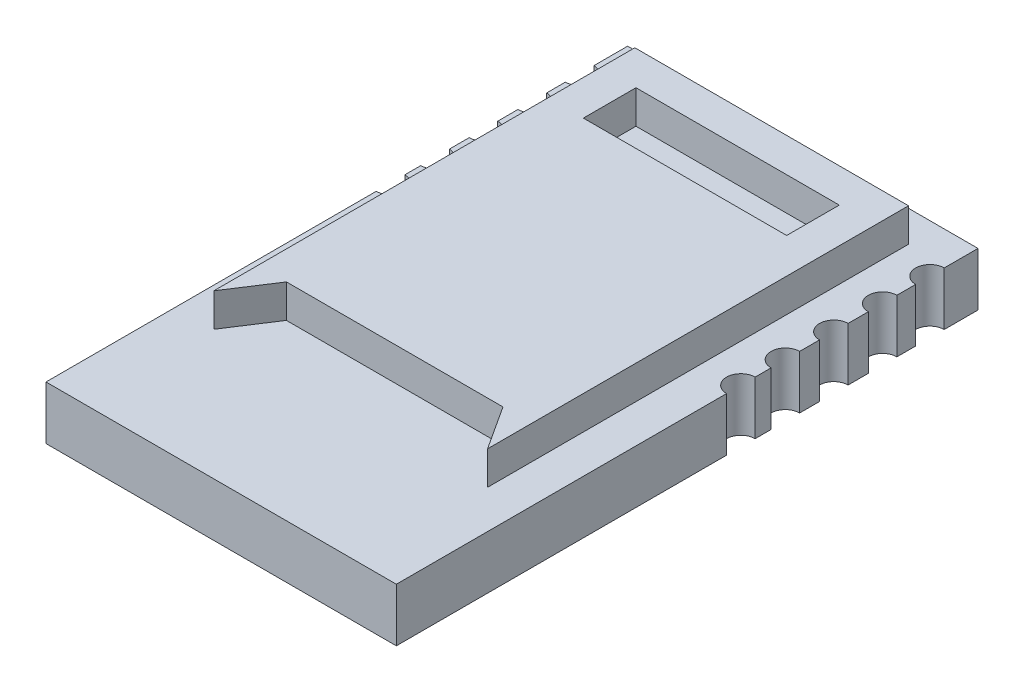
ISO-10303-21;
HEADER;
FILE_DESCRIPTION(('STEP AP214'),'2;1');
FILE_NAME('part.step','',(''),(''),'','','');
FILE_SCHEMA(('AUTOMOTIVE_DESIGN { 1 0 10303 214 1 1 1 1 }'));
ENDSEC;
DATA;
#1=APPLICATION_CONTEXT('core data for automotive mechanical design processes');
#2=APPLICATION_PROTOCOL_DEFINITION('international standard','automotive_design',2000,#1);
#3=PRODUCT_CONTEXT('',#1,'mechanical');
#4=PRODUCT('Part','Part','',(#3));
#5=PRODUCT_RELATED_PRODUCT_CATEGORY('part','',(#4));
#6=PRODUCT_DEFINITION_FORMATION('','',#4);
#7=PRODUCT_DEFINITION_CONTEXT('part definition',#1,'design');
#8=PRODUCT_DEFINITION('design','',#6,#7);
#9=PRODUCT_DEFINITION_SHAPE('','',#8);
#10=(LENGTH_UNIT() NAMED_UNIT(*) SI_UNIT(.MILLI.,.METRE.));
#11=(NAMED_UNIT(*) PLANE_ANGLE_UNIT() SI_UNIT($,.RADIAN.));
#12=(NAMED_UNIT(*) SI_UNIT($,.STERADIAN.) SOLID_ANGLE_UNIT());
#13=UNCERTAINTY_MEASURE_WITH_UNIT(LENGTH_MEASURE(1.E-05),#10,'distance_accuracy_value','');
#14=(GEOMETRIC_REPRESENTATION_CONTEXT(3) GLOBAL_UNCERTAINTY_ASSIGNED_CONTEXT((#13)) GLOBAL_UNIT_ASSIGNED_CONTEXT((#10,
#11,#12)) REPRESENTATION_CONTEXT('',''));
#15=CARTESIAN_POINT('',(0.,0.,0.));
#16=DIRECTION('',(0.,0.,1.));
#17=DIRECTION('',(1.,0.,0.));
#18=AXIS2_PLACEMENT_3D('',#15,#16,#17);
#19=CARTESIAN_POINT('',(0.,8.,0.));
#20=DIRECTION('',(0.,1.,0.));
#21=DIRECTION('',(0.,0.,1.));
#22=AXIS2_PLACEMENT_3D('',#19,#20,#21);
#23=PLANE('',#22);
#24=CARTESIAN_POINT('',(-46.7701166967711,8.,-6.06432348706643));
#25=DIRECTION('',(0.,1.,0.));
#26=DIRECTION('',(0.,0.,1.));
#27=AXIS2_PLACEMENT_3D('',#24,#25,#26);
#28=CIRCLE('',#27,2.14096958321621);
#29=CARTESIAN_POINT('',(-46.7701166967711,8.,-3.92335390385021));
#30=VERTEX_POINT('',#29);
#31=CARTESIAN_POINT('',(-46.7701166967711,8.,-8.20529307028264));
#32=VERTEX_POINT('',#31);
#33=EDGE_CURVE('E345',#30,#32,#28,.T.);
#34=ORIENTED_EDGE('',*,*,#33,.F.);
#35=DIRECTION('',(0.,0.,1.));
#36=VECTOR('',#35,1.);
#37=CARTESIAN_POINT('',(-46.7701166967711,8.,0.));
#38=LINE('',#37,#36);
#39=CARTESIAN_POINT('',(-46.7701166967711,8.,45.5749519462527));
#40=VERTEX_POINT('',#39);
#41=EDGE_CURVE('E348',#30,#40,#38,.T.);
#42=ORIENTED_EDGE('',*,*,#41,.T.);
#43=DIRECTION('',(1.,0.,0.));
#44=VECTOR('',#43,1.);
#45=CARTESIAN_POINT('',(0.,8.,45.5749519462527));
#46=LINE('',#45,#44);
#47=CARTESIAN_POINT('',(5.74475937987076,8.,45.5749519462527));
#48=VERTEX_POINT('',#47);
#49=EDGE_CURVE('E351',#40,#48,#46,.T.);
#50=ORIENTED_EDGE('',*,*,#49,.T.);
#51=DIRECTION('',(0.,0.,1.));
#52=VECTOR('',#51,1.);
#53=CARTESIAN_POINT('',(5.74475937987076,8.,0.));
#54=LINE('',#53,#52);
#55=CARTESIAN_POINT('',(5.74475937987076,8.,-3.92335390385021));
#56=VERTEX_POINT('',#55);
#57=EDGE_CURVE('E355',#56,#48,#54,.T.);
#58=ORIENTED_EDGE('',*,*,#57,.F.);
#59=CARTESIAN_POINT('',(5.74475937987076,8.,-6.06432348706643));
#60=DIRECTION('',(0.,1.,0.));
#61=DIRECTION('',(0.,0.,1.));
#62=AXIS2_PLACEMENT_3D('',#59,#60,#61);
#63=CIRCLE('',#62,2.14096958321622);
#64=CARTESIAN_POINT('',(5.74475937987076,8.,-8.20529307028264));
#65=VERTEX_POINT('',#64);
#66=EDGE_CURVE('E358',#56,#65,#63,.F.);
#67=ORIENTED_EDGE('',*,*,#66,.T.);
#68=CARTESIAN_POINT('',(5.74475937987076,8.,-10.5953432018892));
#69=VERTEX_POINT('',#68);
#70=EDGE_CURVE('E360',#69,#65,#54,.T.);
#71=ORIENTED_EDGE('',*,*,#70,.F.);
#72=CARTESIAN_POINT('',(5.74475937987076,8.,-12.7363127851054));
#73=DIRECTION('',(0.,1.,0.));
#74=DIRECTION('',(0.,0.,1.));
#75=AXIS2_PLACEMENT_3D('',#72,#73,#74);
#76=CIRCLE('',#75,2.14096958321622);
#77=CARTESIAN_POINT('',(5.74475937987076,8.,-14.8772823683217));
#78=VERTEX_POINT('',#77);
#79=EDGE_CURVE('E362',#69,#78,#76,.F.);
#80=ORIENTED_EDGE('',*,*,#79,.T.);
#81=CARTESIAN_POINT('',(5.74475937987076,8.,-17.8568692999403));
#82=VERTEX_POINT('',#81);
#83=EDGE_CURVE('E364',#82,#78,#54,.T.);
#84=ORIENTED_EDGE('',*,*,#83,.F.);
#85=CARTESIAN_POINT('',(5.74475937987076,8.,-19.9978388831565));
#86=DIRECTION('',(0.,1.,0.));
#87=DIRECTION('',(0.,0.,1.));
#88=AXIS2_PLACEMENT_3D('',#85,#86,#87);
#89=CIRCLE('',#88,2.14096958321622);
#90=CARTESIAN_POINT('',(5.74475937987076,8.,-22.1388084663727));
#91=VERTEX_POINT('',#90);
#92=EDGE_CURVE('E365',#82,#91,#89,.F.);
#93=ORIENTED_EDGE('',*,*,#92,.T.);
#94=CARTESIAN_POINT('',(5.74475937987076,8.,-25.1734069593402));
#95=VERTEX_POINT('',#94);
#96=EDGE_CURVE('E367',#95,#91,#54,.T.);
#97=ORIENTED_EDGE('',*,*,#96,.F.);
#98=CARTESIAN_POINT('',(5.74475937987076,8.,-27.3143765425564));
#99=DIRECTION('',(0.,1.,0.));
#100=DIRECTION('',(0.,0.,1.));
#101=AXIS2_PLACEMENT_3D('',#98,#99,#100);
#102=CIRCLE('',#101,2.14096958321622);
#103=CARTESIAN_POINT('',(5.74475937987076,8.,-29.4553461257726));
#104=VERTEX_POINT('',#103);
#105=EDGE_CURVE('E368',#95,#104,#102,.F.);
#106=ORIENTED_EDGE('',*,*,#105,.T.);
#107=CARTESIAN_POINT('',(5.74475937987076,8.,-32.2654170639548));
#108=VERTEX_POINT('',#107);
#109=EDGE_CURVE('E370',#108,#104,#54,.T.);
#110=ORIENTED_EDGE('',*,*,#109,.F.);
#111=CARTESIAN_POINT('',(5.74475937987076,8.,-34.406386647171));
#112=DIRECTION('',(0.,1.,0.));
#113=DIRECTION('',(0.,0.,1.));
#114=AXIS2_PLACEMENT_3D('',#111,#112,#113);
#115=CIRCLE('',#114,2.14096958321622);
#116=CARTESIAN_POINT('',(5.74475937987076,8.,-36.5473562303872));
#117=VERTEX_POINT('',#116);
#118=EDGE_CURVE('E371',#108,#117,#115,.F.);
#119=ORIENTED_EDGE('',*,*,#118,.T.);
#120=CARTESIAN_POINT('',(5.74475937987075,8.,-41.6119126465786));
#121=VERTEX_POINT('',#120);
#122=EDGE_CURVE('E359',#121,#117,#54,.T.);
#123=ORIENTED_EDGE('',*,*,#122,.F.);
#124=DIRECTION('',(1.,0.,0.));
#125=VECTOR('',#124,1.);
#126=CARTESIAN_POINT('',(0.,8.,-41.6119126465786));
#127=LINE('',#126,#125);
#128=CARTESIAN_POINT('',(-46.7701166967711,8.,-41.6119126465786));
#129=VERTEX_POINT('',#128);
#130=EDGE_CURVE('E373',#129,#121,#127,.T.);
#131=ORIENTED_EDGE('',*,*,#130,.F.);
#132=CARTESIAN_POINT('',(-46.7701166967711,8.,-36.5473562303872));
#133=VERTEX_POINT('',#132);
#134=EDGE_CURVE('E353',#129,#133,#38,.T.);
#135=ORIENTED_EDGE('',*,*,#134,.T.);
#136=CARTESIAN_POINT('',(-46.7701166967711,8.,-34.406386647171));
#137=DIRECTION('',(0.,1.,0.));
#138=DIRECTION('',(0.,0.,1.));
#139=AXIS2_PLACEMENT_3D('',#136,#137,#138);
#140=CIRCLE('',#139,2.14096958321621);
#141=CARTESIAN_POINT('',(-46.7701166967711,8.,-32.2654170639548));
#142=VERTEX_POINT('',#141);
#143=EDGE_CURVE('E376',#142,#133,#140,.T.);
#144=ORIENTED_EDGE('',*,*,#143,.F.);
#145=CARTESIAN_POINT('',(-46.7701166967711,8.,-29.4553461257726));
#146=VERTEX_POINT('',#145);
#147=EDGE_CURVE('E379',#142,#146,#38,.T.);
#148=ORIENTED_EDGE('',*,*,#147,.T.);
#149=CARTESIAN_POINT('',(-46.7701166967711,8.,-27.3143765425564));
#150=DIRECTION('',(0.,1.,0.));
#151=DIRECTION('',(0.,0.,1.));
#152=AXIS2_PLACEMENT_3D('',#149,#150,#151);
#153=CIRCLE('',#152,2.14096958321621);
#154=CARTESIAN_POINT('',(-46.7701166967711,8.,-25.1734069593402));
#155=VERTEX_POINT('',#154);
#156=EDGE_CURVE('E380',#155,#146,#153,.T.);
#157=ORIENTED_EDGE('',*,*,#156,.F.);
#158=CARTESIAN_POINT('',(-46.7701166967711,8.,-22.1388084663727));
#159=VERTEX_POINT('',#158);
#160=EDGE_CURVE('E383',#155,#159,#38,.T.);
#161=ORIENTED_EDGE('',*,*,#160,.T.);
#162=CARTESIAN_POINT('',(-46.7701166967711,8.,-19.9978388831565));
#163=DIRECTION('',(0.,1.,0.));
#164=DIRECTION('',(0.,0.,1.));
#165=AXIS2_PLACEMENT_3D('',#162,#163,#164);
#166=CIRCLE('',#165,2.14096958321621);
#167=CARTESIAN_POINT('',(-46.7701166967711,8.,-17.8568692999403));
#168=VERTEX_POINT('',#167);
#169=EDGE_CURVE('E384',#168,#159,#166,.T.);
#170=ORIENTED_EDGE('',*,*,#169,.F.);
#171=CARTESIAN_POINT('',(-46.7701166967711,8.,-14.8772823683217));
#172=VERTEX_POINT('',#171);
#173=EDGE_CURVE('E387',#168,#172,#38,.T.);
#174=ORIENTED_EDGE('',*,*,#173,.T.);
#175=CARTESIAN_POINT('',(-46.7701166967711,8.,-12.7363127851054));
#176=DIRECTION('',(0.,1.,0.));
#177=DIRECTION('',(0.,0.,1.));
#178=AXIS2_PLACEMENT_3D('',#175,#176,#177);
#179=CIRCLE('',#178,2.14096958321621);
#180=CARTESIAN_POINT('',(-46.7701166967711,8.,-10.5953432018892));
#181=VERTEX_POINT('',#180);
#182=EDGE_CURVE('E388',#181,#172,#179,.T.);
#183=ORIENTED_EDGE('',*,*,#182,.F.);
#184=EDGE_CURVE('E352',#181,#32,#38,.T.);
#185=ORIENTED_EDGE('',*,*,#184,.T.);
#186=EDGE_LOOP('',(#34,#42,#50,#58,#67,#71,#80,#84,#93,#97,#106,#110,#119,#123,#131,#135,#144,
#148,#157,#161,#170,#174,#183,#185));
#187=FACE_BOUND('',#186,.T.);
#188=DIRECTION('',(-0.545092128941352,0.,-0.83837615123892));
#189=VECTOR('',#188,1.);
#190=CARTESIAN_POINT('',(-11.9531563718465,8.,7.77165648697218));
#191=LINE('',#190,#189);
#192=CARTESIAN_POINT('',(0.,8.,26.1561472952478));
#193=VERTEX_POINT('',#192);
#194=CARTESIAN_POINT('',(-4.28498879919707,8.,19.5656422653004));
#195=VERTEX_POINT('',#194);
#196=EDGE_CURVE('E338',#193,#195,#191,.T.);
#197=ORIENTED_EDGE('',*,*,#196,.T.);
#198=DIRECTION('',(-1.,0.,0.));
#199=VECTOR('',#198,1.);
#200=CARTESIAN_POINT('',(0.,8.,19.5656422653004));
#201=LINE('',#200,#199);
#202=CARTESIAN_POINT('',(-36.7403685177033,8.,19.5656422653004));
#203=VERTEX_POINT('',#202);
#204=EDGE_CURVE('E341',#195,#203,#201,.T.);
#205=ORIENTED_EDGE('',*,*,#204,.T.);
#206=DIRECTION('',(-0.545092128941352,0.,0.83837615123892));
#207=VECTOR('',#206,1.);
#208=CARTESIAN_POINT('',(-16.8825240510042,8.,-10.9766134965389));
#209=LINE('',#208,#207);
#210=CARTESIAN_POINT('',(-41.0253573169003,8.,26.1561472952478));
#211=VERTEX_POINT('',#210);
#212=EDGE_CURVE('E316',#203,#211,#209,.T.);
#213=ORIENTED_EDGE('',*,*,#212,.T.);
#214=DIRECTION('',(0.,0.,1.));
#215=VECTOR('',#214,1.);
#216=CARTESIAN_POINT('',(-41.0253573169003,8.,0.));
#217=LINE('',#216,#215);
#218=CARTESIAN_POINT('',(-41.0253573169003,8.,-36.9426929638178));
#219=VERTEX_POINT('',#218);
#220=EDGE_CURVE('E331',#219,#211,#217,.T.);
#221=ORIENTED_EDGE('',*,*,#220,.F.);
#222=DIRECTION('',(-1.,0.,0.));
#223=VECTOR('',#222,1.);
#224=CARTESIAN_POINT('',(0.,8.,-36.9426929638178));
#225=LINE('',#224,#223);
#226=CARTESIAN_POINT('',(0.,8.,-36.9426929638178));
#227=VERTEX_POINT('',#226);
#228=EDGE_CURVE('E333',#227,#219,#225,.T.);
#229=ORIENTED_EDGE('',*,*,#228,.F.);
#230=DIRECTION('',(0.,0.,1.));
#231=VECTOR('',#230,1.);
#232=CARTESIAN_POINT('',(0.,8.,0.));
#233=LINE('',#232,#231);
#234=EDGE_CURVE('E335',#227,#193,#233,.T.);
#235=ORIENTED_EDGE('',*,*,#234,.T.);
#236=EDGE_LOOP('',(#197,#205,#213,#221,#229,#235));
#237=FACE_BOUND('',#236,.T.);
#238=ADVANCED_FACE('F35',(#187,#237),#23,.T.);
#239=CARTESIAN_POINT('',(-46.7701166967711,8.,-6.06432348706643));
#240=DIRECTION('',(0.,-1.,0.));
#241=DIRECTION('',(0.,0.,-1.));
#242=AXIS2_PLACEMENT_3D('',#239,#240,#241);
#243=CYLINDRICAL_SURFACE('',#242,2.14096958321621);
#244=CARTESIAN_POINT('',(-46.7701166967711,0.,-6.06432348706643));
#245=DIRECTION('',(0.,1.,0.));
#246=DIRECTION('',(0.,0.,1.));
#247=AXIS2_PLACEMENT_3D('',#244,#245,#246);
#248=CIRCLE('',#247,2.14096958321621);
#249=CARTESIAN_POINT('',(-46.7701166967711,0.,-3.92335390385021));
#250=VERTEX_POINT('',#249);
#251=CARTESIAN_POINT('',(-46.7701166967711,0.,-8.20529307028264));
#252=VERTEX_POINT('',#251);
#253=EDGE_CURVE('E344',#250,#252,#248,.T.);
#254=ORIENTED_EDGE('',*,*,#253,.F.);
#255=DIRECTION('',(0.,-1.,0.));
#256=VECTOR('',#255,1.);
#257=CARTESIAN_POINT('',(-46.7701166967711,8.,-3.92335390385021));
#258=LINE('',#257,#256);
#259=EDGE_CURVE('E11',#30,#250,#258,.T.);
#260=ORIENTED_EDGE('',*,*,#259,.F.);
#261=ORIENTED_EDGE('',*,*,#33,.T.);
#262=DIRECTION('',(0.,-1.,0.));
#263=VECTOR('',#262,1.);
#264=CARTESIAN_POINT('',(-46.7701166967711,8.,-8.20529307028264));
#265=LINE('',#264,#263);
#266=EDGE_CURVE('E440',#32,#252,#265,.T.);
#267=ORIENTED_EDGE('',*,*,#266,.T.);
#268=EDGE_LOOP('',(#254,#260,#261,#267));
#269=FACE_BOUND('',#268,.T.);
#270=ADVANCED_FACE('F37',(#269),#243,.F.);
#271=CARTESIAN_POINT('',(-46.7701166967711,8.,0.));
#272=DIRECTION('',(1.,0.,0.));
#273=DIRECTION('',(0.,0.,-1.));
#274=AXIS2_PLACEMENT_3D('',#271,#272,#273);
#275=PLANE('',#274);
#276=DIRECTION('',(0.,0.,1.));
#277=VECTOR('',#276,1.);
#278=CARTESIAN_POINT('',(-46.7701166967711,0.,0.));
#279=LINE('',#278,#277);
#280=CARTESIAN_POINT('',(-46.7701166967711,0.,45.5749519462527));
#281=VERTEX_POINT('',#280);
#282=EDGE_CURVE('E393',#250,#281,#279,.T.);
#283=ORIENTED_EDGE('',*,*,#282,.T.);
#284=DIRECTION('',(0.,-1.,0.));
#285=VECTOR('',#284,1.);
#286=CARTESIAN_POINT('',(-46.7701166967711,8.,45.5749519462527));
#287=LINE('',#286,#285);
#288=EDGE_CURVE('E43',#40,#281,#287,.T.);
#289=ORIENTED_EDGE('',*,*,#288,.F.);
#290=ORIENTED_EDGE('',*,*,#41,.F.);
#291=ORIENTED_EDGE('',*,*,#259,.T.);
#292=EDGE_LOOP('',(#283,#289,#290,#291));
#293=FACE_BOUND('',#292,.T.);
#294=ADVANCED_FACE('F508',(#293),#275,.F.);
#295=CARTESIAN_POINT('',(0.,8.,45.5749519462527));
#296=DIRECTION('',(0.,0.,-1.));
#297=DIRECTION('',(-1.,0.,0.));
#298=AXIS2_PLACEMENT_3D('',#295,#296,#297);
#299=PLANE('',#298);
#300=DIRECTION('',(1.,0.,0.));
#301=VECTOR('',#300,1.);
#302=CARTESIAN_POINT('',(0.,0.,45.5749519462527));
#303=LINE('',#302,#301);
#304=CARTESIAN_POINT('',(5.74475937987076,0.,45.5749519462527));
#305=VERTEX_POINT('',#304);
#306=EDGE_CURVE('E395',#281,#305,#303,.T.);
#307=ORIENTED_EDGE('',*,*,#306,.T.);
#308=DIRECTION('',(0.,-1.,0.));
#309=VECTOR('',#308,1.);
#310=CARTESIAN_POINT('',(5.74475937987076,8.,45.5749519462527));
#311=LINE('',#310,#309);
#312=EDGE_CURVE('E482',#48,#305,#311,.T.);
#313=ORIENTED_EDGE('',*,*,#312,.F.);
#314=ORIENTED_EDGE('',*,*,#49,.F.);
#315=ORIENTED_EDGE('',*,*,#288,.T.);
#316=EDGE_LOOP('',(#307,#313,#314,#315));
#317=FACE_BOUND('',#316,.T.);
#318=ADVANCED_FACE('F488',(#317),#299,.F.);
#319=CARTESIAN_POINT('',(5.74475937987076,8.,0.));
#320=DIRECTION('',(1.,0.,0.));
#321=DIRECTION('',(0.,0.,-1.));
#322=AXIS2_PLACEMENT_3D('',#319,#320,#321);
#323=PLANE('',#322);
#324=DIRECTION('',(0.,0.,1.));
#325=VECTOR('',#324,1.);
#326=CARTESIAN_POINT('',(5.74475937987076,0.,0.));
#327=LINE('',#326,#325);
#328=CARTESIAN_POINT('',(5.74475937987076,0.,-3.92335390385021));
#329=VERTEX_POINT('',#328);
#330=EDGE_CURVE('E399',#329,#305,#327,.T.);
#331=ORIENTED_EDGE('',*,*,#330,.F.);
#332=DIRECTION('',(0.,-1.,0.));
#333=VECTOR('',#332,1.);
#334=CARTESIAN_POINT('',(5.74475937987076,8.,-3.92335390385021));
#335=LINE('',#334,#333);
#336=EDGE_CURVE('E480',#56,#329,#335,.T.);
#337=ORIENTED_EDGE('',*,*,#336,.F.);
#338=ORIENTED_EDGE('',*,*,#57,.T.);
#339=ORIENTED_EDGE('',*,*,#312,.T.);
#340=EDGE_LOOP('',(#331,#337,#338,#339));
#341=FACE_BOUND('',#340,.T.);
#342=ADVANCED_FACE('F500',(#341),#323,.T.);
#343=CARTESIAN_POINT('',(5.74475937987076,8.,-6.06432348706643));
#344=DIRECTION('',(0.,-1.,0.));
#345=DIRECTION('',(0.,0.,-1.));
#346=AXIS2_PLACEMENT_3D('',#343,#344,#345);
#347=CYLINDRICAL_SURFACE('',#346,2.14096958321622);
#348=CARTESIAN_POINT('',(5.74475937987076,0.,-6.06432348706643));
#349=DIRECTION('',(0.,1.,0.));
#350=DIRECTION('',(0.,0.,1.));
#351=AXIS2_PLACEMENT_3D('',#348,#349,#350);
#352=CIRCLE('',#351,2.14096958321622);
#353=CARTESIAN_POINT('',(5.74475937987076,0.,-8.20529307028264));
#354=VERTEX_POINT('',#353);
#355=EDGE_CURVE('E402',#329,#354,#352,.F.);
#356=ORIENTED_EDGE('',*,*,#355,.T.);
#357=DIRECTION('',(0.,-1.,0.));
#358=VECTOR('',#357,1.);
#359=CARTESIAN_POINT('',(5.74475937987076,8.,-8.20529307028264));
#360=LINE('',#359,#358);
#361=EDGE_CURVE('E478',#65,#354,#360,.T.);
#362=ORIENTED_EDGE('',*,*,#361,.F.);
#363=ORIENTED_EDGE('',*,*,#66,.F.);
#364=ORIENTED_EDGE('',*,*,#336,.T.);
#365=EDGE_LOOP('',(#356,#362,#363,#364));
#366=FACE_BOUND('',#365,.T.);
#367=ADVANCED_FACE('F801',(#366),#347,.F.);
#368=CARTESIAN_POINT('',(5.74475937987076,0.,-10.5953432018892));
#369=VERTEX_POINT('',#368);
#370=EDGE_CURVE('E404',#369,#354,#327,.T.);
#371=ORIENTED_EDGE('',*,*,#370,.F.);
#372=DIRECTION('',(0.,-1.,0.));
#373=VECTOR('',#372,1.);
#374=CARTESIAN_POINT('',(5.74475937987076,8.,-10.5953432018892));
#375=LINE('',#374,#373);
#376=EDGE_CURVE('E476',#69,#369,#375,.T.);
#377=ORIENTED_EDGE('',*,*,#376,.F.);
#378=ORIENTED_EDGE('',*,*,#70,.T.);
#379=ORIENTED_EDGE('',*,*,#361,.T.);
#380=EDGE_LOOP('',(#371,#377,#378,#379));
#381=FACE_BOUND('',#380,.T.);
#382=ADVANCED_FACE('F784',(#381),#323,.T.);
#383=CARTESIAN_POINT('',(5.74475937987076,8.,-12.7363127851054));
#384=DIRECTION('',(0.,-1.,0.));
#385=DIRECTION('',(0.,0.,-1.));
#386=AXIS2_PLACEMENT_3D('',#383,#384,#385);
#387=CYLINDRICAL_SURFACE('',#386,2.14096958321622);
#388=CARTESIAN_POINT('',(5.74475937987076,0.,-12.7363127851054));
#389=DIRECTION('',(0.,1.,0.));
#390=DIRECTION('',(0.,0.,1.));
#391=AXIS2_PLACEMENT_3D('',#388,#389,#390);
#392=CIRCLE('',#391,2.14096958321622);
#393=CARTESIAN_POINT('',(5.74475937987076,0.,-14.8772823683217));
#394=VERTEX_POINT('',#393);
#395=EDGE_CURVE('E407',#369,#394,#392,.F.);
#396=ORIENTED_EDGE('',*,*,#395,.T.);
#397=DIRECTION('',(0.,-1.,0.));
#398=VECTOR('',#397,1.);
#399=CARTESIAN_POINT('',(5.74475937987076,8.,-14.8772823683217));
#400=LINE('',#399,#398);
#401=EDGE_CURVE('E474',#78,#394,#400,.T.);
#402=ORIENTED_EDGE('',*,*,#401,.F.);
#403=ORIENTED_EDGE('',*,*,#79,.F.);
#404=ORIENTED_EDGE('',*,*,#376,.T.);
#405=EDGE_LOOP('',(#396,#402,#403,#404));
#406=FACE_BOUND('',#405,.T.);
#407=ADVANCED_FACE('F782',(#406),#387,.F.);
#408=CARTESIAN_POINT('',(5.74475937987076,0.,-17.8568692999403));
#409=VERTEX_POINT('',#408);
#410=EDGE_CURVE('E410',#409,#394,#327,.T.);
#411=ORIENTED_EDGE('',*,*,#410,.F.);
#412=DIRECTION('',(0.,-1.,0.));
#413=VECTOR('',#412,1.);
#414=CARTESIAN_POINT('',(5.74475937987076,8.,-17.8568692999403));
#415=LINE('',#414,#413);
#416=EDGE_CURVE('E472',#82,#409,#415,.T.);
#417=ORIENTED_EDGE('',*,*,#416,.F.);
#418=ORIENTED_EDGE('',*,*,#83,.T.);
#419=ORIENTED_EDGE('',*,*,#401,.T.);
#420=EDGE_LOOP('',(#411,#417,#418,#419));
#421=FACE_BOUND('',#420,.T.);
#422=ADVANCED_FACE('F765',(#421),#323,.T.);
#423=CARTESIAN_POINT('',(5.74475937987076,8.,-19.9978388831565));
#424=DIRECTION('',(0.,-1.,0.));
#425=DIRECTION('',(0.,0.,-1.));
#426=AXIS2_PLACEMENT_3D('',#423,#424,#425);
#427=CYLINDRICAL_SURFACE('',#426,2.14096958321622);
#428=CARTESIAN_POINT('',(5.74475937987076,0.,-19.9978388831565));
#429=DIRECTION('',(0.,1.,0.));
#430=DIRECTION('',(0.,0.,1.));
#431=AXIS2_PLACEMENT_3D('',#428,#429,#430);
#432=CIRCLE('',#431,2.14096958321622);
#433=CARTESIAN_POINT('',(5.74475937987076,0.,-22.1388084663727));
#434=VERTEX_POINT('',#433);
#435=EDGE_CURVE('E411',#409,#434,#432,.F.);
#436=ORIENTED_EDGE('',*,*,#435,.T.);
#437=DIRECTION('',(0.,-1.,0.));
#438=VECTOR('',#437,1.);
#439=CARTESIAN_POINT('',(5.74475937987076,8.,-22.1388084663727));
#440=LINE('',#439,#438);
#441=EDGE_CURVE('E470',#91,#434,#440,.T.);
#442=ORIENTED_EDGE('',*,*,#441,.F.);
#443=ORIENTED_EDGE('',*,*,#92,.F.);
#444=ORIENTED_EDGE('',*,*,#416,.T.);
#445=EDGE_LOOP('',(#436,#442,#443,#444));
#446=FACE_BOUND('',#445,.T.);
#447=ADVANCED_FACE('F763',(#446),#427,.F.);
#448=CARTESIAN_POINT('',(5.74475937987076,0.,-25.1734069593402));
#449=VERTEX_POINT('',#448);
#450=EDGE_CURVE('E414',#449,#434,#327,.T.);
#451=ORIENTED_EDGE('',*,*,#450,.F.);
#452=DIRECTION('',(0.,-1.,0.));
#453=VECTOR('',#452,1.);
#454=CARTESIAN_POINT('',(5.74475937987076,8.,-25.1734069593402));
#455=LINE('',#454,#453);
#456=EDGE_CURVE('E468',#95,#449,#455,.T.);
#457=ORIENTED_EDGE('',*,*,#456,.F.);
#458=ORIENTED_EDGE('',*,*,#96,.T.);
#459=ORIENTED_EDGE('',*,*,#441,.T.);
#460=EDGE_LOOP('',(#451,#457,#458,#459));
#461=FACE_BOUND('',#460,.T.);
#462=ADVANCED_FACE('F746',(#461),#323,.T.);
#463=CARTESIAN_POINT('',(5.74475937987076,8.,-27.3143765425564));
#464=DIRECTION('',(0.,-1.,0.));
#465=DIRECTION('',(0.,0.,-1.));
#466=AXIS2_PLACEMENT_3D('',#463,#464,#465);
#467=CYLINDRICAL_SURFACE('',#466,2.14096958321622);
#468=CARTESIAN_POINT('',(5.74475937987076,0.,-27.3143765425564));
#469=DIRECTION('',(0.,1.,0.));
#470=DIRECTION('',(0.,0.,1.));
#471=AXIS2_PLACEMENT_3D('',#468,#469,#470);
#472=CIRCLE('',#471,2.14096958321622);
#473=CARTESIAN_POINT('',(5.74475937987076,0.,-29.4553461257726));
#474=VERTEX_POINT('',#473);
#475=EDGE_CURVE('E415',#449,#474,#472,.F.);
#476=ORIENTED_EDGE('',*,*,#475,.T.);
#477=DIRECTION('',(0.,-1.,0.));
#478=VECTOR('',#477,1.);
#479=CARTESIAN_POINT('',(5.74475937987076,8.,-29.4553461257726));
#480=LINE('',#479,#478);
#481=EDGE_CURVE('E466',#104,#474,#480,.T.);
#482=ORIENTED_EDGE('',*,*,#481,.F.);
#483=ORIENTED_EDGE('',*,*,#105,.F.);
#484=ORIENTED_EDGE('',*,*,#456,.T.);
#485=EDGE_LOOP('',(#476,#482,#483,#484));
#486=FACE_BOUND('',#485,.T.);
#487=ADVANCED_FACE('F744',(#486),#467,.F.);
#488=CARTESIAN_POINT('',(5.74475937987076,0.,-32.2654170639548));
#489=VERTEX_POINT('',#488);
#490=EDGE_CURVE('E418',#489,#474,#327,.T.);
#491=ORIENTED_EDGE('',*,*,#490,.F.);
#492=DIRECTION('',(0.,-1.,0.));
#493=VECTOR('',#492,1.);
#494=CARTESIAN_POINT('',(5.74475937987076,8.,-32.2654170639548));
#495=LINE('',#494,#493);
#496=EDGE_CURVE('E464',#108,#489,#495,.T.);
#497=ORIENTED_EDGE('',*,*,#496,.F.);
#498=ORIENTED_EDGE('',*,*,#109,.T.);
#499=ORIENTED_EDGE('',*,*,#481,.T.);
#500=EDGE_LOOP('',(#491,#497,#498,#499));
#501=FACE_BOUND('',#500,.T.);
#502=ADVANCED_FACE('F727',(#501),#323,.T.);
#503=CARTESIAN_POINT('',(5.74475937987076,8.,-34.406386647171));
#504=DIRECTION('',(0.,-1.,0.));
#505=DIRECTION('',(0.,0.,-1.));
#506=AXIS2_PLACEMENT_3D('',#503,#504,#505);
#507=CYLINDRICAL_SURFACE('',#506,2.14096958321622);
#508=CARTESIAN_POINT('',(5.74475937987076,0.,-34.406386647171));
#509=DIRECTION('',(0.,1.,0.));
#510=DIRECTION('',(0.,0.,1.));
#511=AXIS2_PLACEMENT_3D('',#508,#509,#510);
#512=CIRCLE('',#511,2.14096958321622);
#513=CARTESIAN_POINT('',(5.74475937987076,0.,-36.5473562303872));
#514=VERTEX_POINT('',#513);
#515=EDGE_CURVE('E419',#489,#514,#512,.F.);
#516=ORIENTED_EDGE('',*,*,#515,.T.);
#517=DIRECTION('',(0.,-1.,0.));
#518=VECTOR('',#517,1.);
#519=CARTESIAN_POINT('',(5.74475937987076,8.,-36.5473562303872));
#520=LINE('',#519,#518);
#521=EDGE_CURVE('E462',#117,#514,#520,.T.);
#522=ORIENTED_EDGE('',*,*,#521,.F.);
#523=ORIENTED_EDGE('',*,*,#118,.F.);
#524=ORIENTED_EDGE('',*,*,#496,.T.);
#525=EDGE_LOOP('',(#516,#522,#523,#524));
#526=FACE_BOUND('',#525,.T.);
#527=ADVANCED_FACE('F724',(#526),#507,.F.);
#528=CARTESIAN_POINT('',(5.74475937987075,0.,-41.6119126465786));
#529=VERTEX_POINT('',#528);
#530=EDGE_CURVE('E403',#529,#514,#327,.T.);
#531=ORIENTED_EDGE('',*,*,#530,.F.);
#532=DIRECTION('',(0.,-1.,0.));
#533=VECTOR('',#532,1.);
#534=CARTESIAN_POINT('',(5.74475937987075,8.,-41.6119126465786));
#535=LINE('',#534,#533);
#536=EDGE_CURVE('E460',#121,#529,#535,.T.);
#537=ORIENTED_EDGE('',*,*,#536,.F.);
#538=ORIENTED_EDGE('',*,*,#122,.T.);
#539=ORIENTED_EDGE('',*,*,#521,.T.);
#540=EDGE_LOOP('',(#531,#537,#538,#539));
#541=FACE_BOUND('',#540,.T.);
#542=ADVANCED_FACE('F714',(#541),#323,.T.);
#543=CARTESIAN_POINT('',(0.,8.,-41.6119126465786));
#544=DIRECTION('',(0.,0.,-1.));
#545=DIRECTION('',(-1.,0.,0.));
#546=AXIS2_PLACEMENT_3D('',#543,#544,#545);
#547=PLANE('',#546);
#548=DIRECTION('',(1.,0.,0.));
#549=VECTOR('',#548,1.);
#550=CARTESIAN_POINT('',(0.,0.,-41.6119126465786));
#551=LINE('',#550,#549);
#552=CARTESIAN_POINT('',(-46.7701166967711,0.,-41.6119126465786));
#553=VERTEX_POINT('',#552);
#554=EDGE_CURVE('E422',#553,#529,#551,.T.);
#555=ORIENTED_EDGE('',*,*,#554,.F.);
#556=DIRECTION('',(0.,-1.,0.));
#557=VECTOR('',#556,1.);
#558=CARTESIAN_POINT('',(-46.7701166967711,8.,-41.6119126465786));
#559=LINE('',#558,#557);
#560=EDGE_CURVE('E458',#129,#553,#559,.T.);
#561=ORIENTED_EDGE('',*,*,#560,.F.);
#562=ORIENTED_EDGE('',*,*,#130,.T.);
#563=ORIENTED_EDGE('',*,*,#536,.T.);
#564=EDGE_LOOP('',(#555,#561,#562,#563));
#565=FACE_BOUND('',#564,.T.);
#566=ADVANCED_FACE('F706',(#565),#547,.T.);
#567=CARTESIAN_POINT('',(-46.7701166967711,0.,-36.5473562303872));
#568=VERTEX_POINT('',#567);
#569=EDGE_CURVE('E396',#553,#568,#279,.T.);
#570=ORIENTED_EDGE('',*,*,#569,.T.);
#571=DIRECTION('',(0.,-1.,0.));
#572=VECTOR('',#571,1.);
#573=CARTESIAN_POINT('',(-46.7701166967711,8.,-36.5473562303872));
#574=LINE('',#573,#572);
#575=EDGE_CURVE('E456',#133,#568,#574,.T.);
#576=ORIENTED_EDGE('',*,*,#575,.F.);
#577=ORIENTED_EDGE('',*,*,#134,.F.);
#578=ORIENTED_EDGE('',*,*,#560,.T.);
#579=EDGE_LOOP('',(#570,#576,#577,#578));
#580=FACE_BOUND('',#579,.T.);
#581=ADVANCED_FACE('F538',(#580),#275,.F.);
#582=CARTESIAN_POINT('',(-46.7701166967711,8.,-34.406386647171));
#583=DIRECTION('',(0.,-1.,0.));
#584=DIRECTION('',(0.,0.,-1.));
#585=AXIS2_PLACEMENT_3D('',#582,#583,#584);
#586=CYLINDRICAL_SURFACE('',#585,2.14096958321621);
#587=CARTESIAN_POINT('',(-46.7701166967711,0.,-34.406386647171));
#588=DIRECTION('',(0.,1.,0.));
#589=DIRECTION('',(0.,0.,1.));
#590=AXIS2_PLACEMENT_3D('',#587,#588,#589);
#591=CIRCLE('',#590,2.14096958321621);
#592=CARTESIAN_POINT('',(-46.7701166967711,0.,-32.2654170639548));
#593=VERTEX_POINT('',#592);
#594=EDGE_CURVE('E425',#593,#568,#591,.T.);
#595=ORIENTED_EDGE('',*,*,#594,.F.);
#596=DIRECTION('',(0.,-1.,0.));
#597=VECTOR('',#596,1.);
#598=CARTESIAN_POINT('',(-46.7701166967711,8.,-32.2654170639548));
#599=LINE('',#598,#597);
#600=EDGE_CURVE('E454',#142,#593,#599,.T.);
#601=ORIENTED_EDGE('',*,*,#600,.F.);
#602=ORIENTED_EDGE('',*,*,#143,.T.);
#603=ORIENTED_EDGE('',*,*,#575,.T.);
#604=EDGE_LOOP('',(#595,#601,#602,#603));
#605=FACE_BOUND('',#604,.T.);
#606=ADVANCED_FACE('F543',(#605),#586,.F.);
#607=CARTESIAN_POINT('',(-46.7701166967711,0.,-29.4553461257726));
#608=VERTEX_POINT('',#607);
#609=EDGE_CURVE('E428',#593,#608,#279,.T.);
#610=ORIENTED_EDGE('',*,*,#609,.T.);
#611=DIRECTION('',(0.,-1.,0.));
#612=VECTOR('',#611,1.);
#613=CARTESIAN_POINT('',(-46.7701166967711,8.,-29.4553461257726));
#614=LINE('',#613,#612);
#615=EDGE_CURVE('E452',#146,#608,#614,.T.);
#616=ORIENTED_EDGE('',*,*,#615,.F.);
#617=ORIENTED_EDGE('',*,*,#147,.F.);
#618=ORIENTED_EDGE('',*,*,#600,.T.);
#619=EDGE_LOOP('',(#610,#616,#617,#618));
#620=FACE_BOUND('',#619,.T.);
#621=ADVANCED_FACE('F674',(#620),#275,.F.);
#622=CARTESIAN_POINT('',(-46.7701166967711,8.,-27.3143765425564));
#623=DIRECTION('',(0.,-1.,0.));
#624=DIRECTION('',(0.,0.,-1.));
#625=AXIS2_PLACEMENT_3D('',#622,#623,#624);
#626=CYLINDRICAL_SURFACE('',#625,2.14096958321621);
#627=CARTESIAN_POINT('',(-46.7701166967711,0.,-27.3143765425564));
#628=DIRECTION('',(0.,1.,0.));
#629=DIRECTION('',(0.,0.,1.));
#630=AXIS2_PLACEMENT_3D('',#627,#628,#629);
#631=CIRCLE('',#630,2.14096958321621);
#632=CARTESIAN_POINT('',(-46.7701166967711,0.,-25.1734069593402));
#633=VERTEX_POINT('',#632);
#634=EDGE_CURVE('E429',#633,#608,#631,.T.);
#635=ORIENTED_EDGE('',*,*,#634,.F.);
#636=DIRECTION('',(0.,-1.,0.));
#637=VECTOR('',#636,1.);
#638=CARTESIAN_POINT('',(-46.7701166967711,8.,-25.1734069593402));
#639=LINE('',#638,#637);
#640=EDGE_CURVE('E450',#155,#633,#639,.T.);
#641=ORIENTED_EDGE('',*,*,#640,.F.);
#642=ORIENTED_EDGE('',*,*,#156,.T.);
#643=ORIENTED_EDGE('',*,*,#615,.T.);
#644=EDGE_LOOP('',(#635,#641,#642,#643));
#645=FACE_BOUND('',#644,.T.);
#646=ADVANCED_FACE('F673',(#645),#626,.F.);
#647=CARTESIAN_POINT('',(-46.7701166967711,0.,-22.1388084663727));
#648=VERTEX_POINT('',#647);
#649=EDGE_CURVE('E432',#633,#648,#279,.T.);
#650=ORIENTED_EDGE('',*,*,#649,.T.);
#651=DIRECTION('',(0.,-1.,0.));
#652=VECTOR('',#651,1.);
#653=CARTESIAN_POINT('',(-46.7701166967711,8.,-22.1388084663727));
#654=LINE('',#653,#652);
#655=EDGE_CURVE('E448',#159,#648,#654,.T.);
#656=ORIENTED_EDGE('',*,*,#655,.F.);
#657=ORIENTED_EDGE('',*,*,#160,.F.);
#658=ORIENTED_EDGE('',*,*,#640,.T.);
#659=EDGE_LOOP('',(#650,#656,#657,#658));
#660=FACE_BOUND('',#659,.T.);
#661=ADVANCED_FACE('F564',(#660),#275,.F.);
#662=CARTESIAN_POINT('',(-46.7701166967711,8.,-19.9978388831565));
#663=DIRECTION('',(0.,-1.,0.));
#664=DIRECTION('',(0.,0.,-1.));
#665=AXIS2_PLACEMENT_3D('',#662,#663,#664);
#666=CYLINDRICAL_SURFACE('',#665,2.14096958321621);
#667=CARTESIAN_POINT('',(-46.7701166967711,0.,-19.9978388831565));
#668=DIRECTION('',(0.,1.,0.));
#669=DIRECTION('',(0.,0.,1.));
#670=AXIS2_PLACEMENT_3D('',#667,#668,#669);
#671=CIRCLE('',#670,2.14096958321621);
#672=CARTESIAN_POINT('',(-46.7701166967711,0.,-17.8568692999403));
#673=VERTEX_POINT('',#672);
#674=EDGE_CURVE('E433',#673,#648,#671,.T.);
#675=ORIENTED_EDGE('',*,*,#674,.F.);
#676=DIRECTION('',(0.,-1.,0.));
#677=VECTOR('',#676,1.);
#678=CARTESIAN_POINT('',(-46.7701166967711,8.,-17.8568692999403));
#679=LINE('',#678,#677);
#680=EDGE_CURVE('E446',#168,#673,#679,.T.);
#681=ORIENTED_EDGE('',*,*,#680,.F.);
#682=ORIENTED_EDGE('',*,*,#169,.T.);
#683=ORIENTED_EDGE('',*,*,#655,.T.);
#684=EDGE_LOOP('',(#675,#681,#682,#683));
#685=FACE_BOUND('',#684,.T.);
#686=ADVANCED_FACE('F563',(#685),#666,.F.);
#687=CARTESIAN_POINT('',(-46.7701166967711,0.,-14.8772823683217));
#688=VERTEX_POINT('',#687);
#689=EDGE_CURVE('E436',#673,#688,#279,.T.);
#690=ORIENTED_EDGE('',*,*,#689,.T.);
#691=DIRECTION('',(0.,-1.,0.));
#692=VECTOR('',#691,1.);
#693=CARTESIAN_POINT('',(-46.7701166967711,8.,-14.8772823683217));
#694=LINE('',#693,#692);
#695=EDGE_CURVE('E444',#172,#688,#694,.T.);
#696=ORIENTED_EDGE('',*,*,#695,.F.);
#697=ORIENTED_EDGE('',*,*,#173,.F.);
#698=ORIENTED_EDGE('',*,*,#680,.T.);
#699=EDGE_LOOP('',(#690,#696,#697,#698));
#700=FACE_BOUND('',#699,.T.);
#701=ADVANCED_FACE('F524',(#700),#275,.F.);
#702=CARTESIAN_POINT('',(-46.7701166967711,8.,-12.7363127851054));
#703=DIRECTION('',(0.,-1.,0.));
#704=DIRECTION('',(0.,0.,-1.));
#705=AXIS2_PLACEMENT_3D('',#702,#703,#704);
#706=CYLINDRICAL_SURFACE('',#705,2.14096958321621);
#707=CARTESIAN_POINT('',(-46.7701166967711,0.,-12.7363127851054));
#708=DIRECTION('',(0.,1.,0.));
#709=DIRECTION('',(0.,0.,1.));
#710=AXIS2_PLACEMENT_3D('',#707,#708,#709);
#711=CIRCLE('',#710,2.14096958321621);
#712=CARTESIAN_POINT('',(-46.7701166967711,0.,-10.5953432018892));
#713=VERTEX_POINT('',#712);
#714=EDGE_CURVE('E437',#713,#688,#711,.T.);
#715=ORIENTED_EDGE('',*,*,#714,.F.);
#716=DIRECTION('',(0.,-1.,0.));
#717=VECTOR('',#716,1.);
#718=CARTESIAN_POINT('',(-46.7701166967711,8.,-10.5953432018892));
#719=LINE('',#718,#717);
#720=EDGE_CURVE('E442',#181,#713,#719,.T.);
#721=ORIENTED_EDGE('',*,*,#720,.F.);
#722=ORIENTED_EDGE('',*,*,#182,.T.);
#723=ORIENTED_EDGE('',*,*,#695,.T.);
#724=EDGE_LOOP('',(#715,#721,#722,#723));
#725=FACE_BOUND('',#724,.T.);
#726=ADVANCED_FACE('F517',(#725),#706,.F.);
#727=EDGE_CURVE('E349',#713,#252,#279,.T.);
#728=ORIENTED_EDGE('',*,*,#727,.T.);
#729=ORIENTED_EDGE('',*,*,#266,.F.);
#730=ORIENTED_EDGE('',*,*,#184,.F.);
#731=ORIENTED_EDGE('',*,*,#720,.T.);
#732=EDGE_LOOP('',(#728,#729,#730,#731));
#733=FACE_BOUND('',#732,.T.);
#734=ADVANCED_FACE('F551',(#733),#275,.F.);
#735=CARTESIAN_POINT('',(0.,0.,0.));
#736=DIRECTION('',(0.,1.,0.));
#737=DIRECTION('',(0.,0.,1.));
#738=AXIS2_PLACEMENT_3D('',#735,#736,#737);
#739=PLANE('',#738);
#740=ORIENTED_EDGE('',*,*,#253,.T.);
#741=ORIENTED_EDGE('',*,*,#727,.F.);
#742=ORIENTED_EDGE('',*,*,#714,.T.);
#743=ORIENTED_EDGE('',*,*,#689,.F.);
#744=ORIENTED_EDGE('',*,*,#674,.T.);
#745=ORIENTED_EDGE('',*,*,#649,.F.);
#746=ORIENTED_EDGE('',*,*,#634,.T.);
#747=ORIENTED_EDGE('',*,*,#609,.F.);
#748=ORIENTED_EDGE('',*,*,#594,.T.);
#749=ORIENTED_EDGE('',*,*,#569,.F.);
#750=ORIENTED_EDGE('',*,*,#554,.T.);
#751=ORIENTED_EDGE('',*,*,#530,.T.);
#752=ORIENTED_EDGE('',*,*,#515,.F.);
#753=ORIENTED_EDGE('',*,*,#490,.T.);
#754=ORIENTED_EDGE('',*,*,#475,.F.);
#755=ORIENTED_EDGE('',*,*,#450,.T.);
#756=ORIENTED_EDGE('',*,*,#435,.F.);
#757=ORIENTED_EDGE('',*,*,#410,.T.);
#758=ORIENTED_EDGE('',*,*,#395,.F.);
#759=ORIENTED_EDGE('',*,*,#370,.T.);
#760=ORIENTED_EDGE('',*,*,#355,.F.);
#761=ORIENTED_EDGE('',*,*,#330,.T.);
#762=ORIENTED_EDGE('',*,*,#306,.F.);
#763=ORIENTED_EDGE('',*,*,#282,.F.);
#764=EDGE_LOOP('',(#740,#741,#742,#743,#744,#745,#746,#747,#748,#749,#750,#751,#752,#753,#754,
#755,#756,#757,#758,#759,#760,#761,#762,#763));
#765=FACE_BOUND('',#764,.T.);
#766=ADVANCED_FACE('F494',(#765),#739,.F.);
#767=CARTESIAN_POINT('',(0.,13.,19.5656422653004));
#768=DIRECTION('',(0.,0.,-1.));
#769=DIRECTION('',(-1.,0.,0.));
#770=AXIS2_PLACEMENT_3D('',#767,#768,#769);
#771=PLANE('',#770);
#772=ORIENTED_EDGE('',*,*,#204,.F.);
#773=DIRECTION('',(0.,-1.,0.));
#774=VECTOR('',#773,1.);
#775=CARTESIAN_POINT('',(-4.28498879919707,13.,19.5656422653004));
#776=LINE('',#775,#774);
#777=CARTESIAN_POINT('',(-4.28498879919707,13.,19.5656422653004));
#778=VERTEX_POINT('',#777);
#779=EDGE_CURVE('E313',#778,#195,#776,.T.);
#780=ORIENTED_EDGE('',*,*,#779,.F.);
#781=DIRECTION('',(1.,0.,0.));
#782=VECTOR('',#781,1.);
#783=CARTESIAN_POINT('',(0.,13.,19.5656422653004));
#784=LINE('',#783,#782);
#785=CARTESIAN_POINT('',(-36.7403685177033,13.,19.5656422653004));
#786=VERTEX_POINT('',#785);
#787=EDGE_CURVE('E285',#786,#778,#784,.T.);
#788=ORIENTED_EDGE('',*,*,#787,.F.);
#789=DIRECTION('',(0.,-1.,0.));
#790=VECTOR('',#789,1.);
#791=CARTESIAN_POINT('',(-36.7403685177033,13.,19.5656422653004));
#792=LINE('',#791,#790);
#793=EDGE_CURVE('E266',#786,#203,#792,.T.);
#794=ORIENTED_EDGE('',*,*,#793,.T.);
#795=EDGE_LOOP('',(#772,#780,#788,#794));
#796=FACE_BOUND('',#795,.T.);
#797=ADVANCED_FACE('F558',(#796),#771,.F.);
#798=CARTESIAN_POINT('',(-11.9531563718465,13.,7.77165648697218));
#799=DIRECTION('',(0.83837615123892,0.,-0.545092128941352));
#800=DIRECTION('',(-0.545092128941352,0.,-0.83837615123892));
#801=AXIS2_PLACEMENT_3D('',#798,#799,#800);
#802=PLANE('',#801);
#803=ORIENTED_EDGE('',*,*,#196,.F.);
#804=DIRECTION('',(0.,-1.,0.));
#805=VECTOR('',#804,1.);
#806=CARTESIAN_POINT('',(0.,13.,26.1561472952478));
#807=LINE('',#806,#805);
#808=CARTESIAN_POINT('',(0.,13.,26.1561472952478));
#809=VERTEX_POINT('',#808);
#810=EDGE_CURVE('E310',#809,#193,#807,.T.);
#811=ORIENTED_EDGE('',*,*,#810,.F.);
#812=DIRECTION('',(0.545092128941352,0.,0.83837615123892));
#813=VECTOR('',#812,1.);
#814=CARTESIAN_POINT('',(-11.9531563718465,13.,7.77165648697218));
#815=LINE('',#814,#813);
#816=EDGE_CURVE('E288',#778,#809,#815,.T.);
#817=ORIENTED_EDGE('',*,*,#816,.F.);
#818=ORIENTED_EDGE('',*,*,#779,.T.);
#819=EDGE_LOOP('',(#803,#811,#817,#818));
#820=FACE_BOUND('',#819,.T.);
#821=ADVANCED_FACE('F610',(#820),#802,.F.);
#822=CARTESIAN_POINT('',(0.,13.,0.));
#823=DIRECTION('',(-1.,0.,0.));
#824=DIRECTION('',(0.,0.,1.));
#825=AXIS2_PLACEMENT_3D('',#822,#823,#824);
#826=PLANE('',#825);
#827=ORIENTED_EDGE('',*,*,#234,.F.);
#828=DIRECTION('',(0.,-1.,0.));
#829=VECTOR('',#828,1.);
#830=CARTESIAN_POINT('',(0.,13.,-36.9426929638178));
#831=LINE('',#830,#829);
#832=CARTESIAN_POINT('',(0.,13.,-36.9426929638178));
#833=VERTEX_POINT('',#832);
#834=EDGE_CURVE('E307',#833,#227,#831,.T.);
#835=ORIENTED_EDGE('',*,*,#834,.F.);
#836=DIRECTION('',(0.,0.,-1.));
#837=VECTOR('',#836,1.);
#838=CARTESIAN_POINT('',(0.,13.,0.));
#839=LINE('',#838,#837);
#840=EDGE_CURVE('E290',#809,#833,#839,.T.);
#841=ORIENTED_EDGE('',*,*,#840,.F.);
#842=ORIENTED_EDGE('',*,*,#810,.T.);
#843=EDGE_LOOP('',(#827,#835,#841,#842));
#844=FACE_BOUND('',#843,.T.);
#845=ADVANCED_FACE('F605',(#844),#826,.F.);
#846=CARTESIAN_POINT('',(0.,13.,-36.9426929638178));
#847=DIRECTION('',(0.,0.,-1.));
#848=DIRECTION('',(-1.,0.,0.));
#849=AXIS2_PLACEMENT_3D('',#846,#847,#848);
#850=PLANE('',#849);
#851=ORIENTED_EDGE('',*,*,#834,.T.);
#852=ORIENTED_EDGE('',*,*,#228,.T.);
#853=DIRECTION('',(0.,-1.,0.));
#854=VECTOR('',#853,1.);
#855=CARTESIAN_POINT('',(-41.0253573169003,13.,-36.9426929638178));
#856=LINE('',#855,#854);
#857=CARTESIAN_POINT('',(-41.0253573169003,13.,-36.9426929638178));
#858=VERTEX_POINT('',#857);
#859=EDGE_CURVE('E304',#858,#219,#856,.T.);
#860=ORIENTED_EDGE('',*,*,#859,.F.);
#861=DIRECTION('',(1.,0.,0.));
#862=VECTOR('',#861,1.);
#863=CARTESIAN_POINT('',(0.,13.,-36.9426929638178));
#864=LINE('',#863,#862);
#865=EDGE_CURVE('E292',#858,#833,#864,.T.);
#866=ORIENTED_EDGE('',*,*,#865,.T.);
#867=EDGE_LOOP('',(#851,#852,#860,#866));
#868=FACE_BOUND('',#867,.T.);
#869=ADVANCED_FACE('F599',(#868),#850,.T.);
#870=CARTESIAN_POINT('',(-41.0253573169003,13.,0.));
#871=DIRECTION('',(-1.,0.,0.));
#872=DIRECTION('',(0.,0.,1.));
#873=AXIS2_PLACEMENT_3D('',#870,#871,#872);
#874=PLANE('',#873);
#875=ORIENTED_EDGE('',*,*,#859,.T.);
#876=ORIENTED_EDGE('',*,*,#220,.T.);
#877=DIRECTION('',(0.,-1.,0.));
#878=VECTOR('',#877,1.);
#879=CARTESIAN_POINT('',(-41.0253573169003,13.,26.1561472952478));
#880=LINE('',#879,#878);
#881=CARTESIAN_POINT('',(-41.0253573169003,13.,26.1561472952478));
#882=VERTEX_POINT('',#881);
#883=EDGE_CURVE('E58',#882,#211,#880,.T.);
#884=ORIENTED_EDGE('',*,*,#883,.F.);
#885=DIRECTION('',(0.,0.,-1.));
#886=VECTOR('',#885,1.);
#887=CARTESIAN_POINT('',(-41.0253573169003,13.,0.));
#888=LINE('',#887,#886);
#889=EDGE_CURVE('E295',#882,#858,#888,.T.);
#890=ORIENTED_EDGE('',*,*,#889,.T.);
#891=EDGE_LOOP('',(#875,#876,#884,#890));
#892=FACE_BOUND('',#891,.T.);
#893=ADVANCED_FACE('F595',(#892),#874,.T.);
#894=CARTESIAN_POINT('',(-5.27675951004314,13.,0.));
#895=DIRECTION('',(-1.,0.,0.));
#896=DIRECTION('',(0.,0.,1.));
#897=AXIS2_PLACEMENT_3D('',#894,#895,#896);
#898=PLANE('',#897);
#899=DIRECTION('',(0.,-1.,0.));
#900=VECTOR('',#899,1.);
#901=CARTESIAN_POINT('',(-5.27675951004314,13.,-31.8391102958051));
#902=LINE('',#901,#900);
#903=CARTESIAN_POINT('',(-5.27675951004314,13.,-31.8391102958051));
#904=VERTEX_POINT('',#903);
#905=CARTESIAN_POINT('',(-5.27675951004314,8.,-31.8391102958051));
#906=VERTEX_POINT('',#905);
#907=EDGE_CURVE('E300',#904,#906,#902,.T.);
#908=ORIENTED_EDGE('',*,*,#907,.T.);
#909=DIRECTION('',(0.,0.,1.));
#910=VECTOR('',#909,1.);
#911=CARTESIAN_POINT('',(-5.27675951004314,8.,0.));
#912=LINE('',#911,#910);
#913=CARTESIAN_POINT('',(-5.27675951004314,8.,-23.9517552634219));
#914=VERTEX_POINT('',#913);
#915=EDGE_CURVE('E262',#906,#914,#912,.T.);
#916=ORIENTED_EDGE('',*,*,#915,.T.);
#917=DIRECTION('',(0.,-1.,0.));
#918=VECTOR('',#917,1.);
#919=CARTESIAN_POINT('',(-5.27675951004314,13.,-23.9517552634219));
#920=LINE('',#919,#918);
#921=CARTESIAN_POINT('',(-5.27675951004314,13.,-23.9517552634219));
#922=VERTEX_POINT('',#921);
#923=EDGE_CURVE('E256',#922,#914,#920,.T.);
#924=ORIENTED_EDGE('',*,*,#923,.F.);
#925=DIRECTION('',(0.,0.,-1.));
#926=VECTOR('',#925,1.);
#927=CARTESIAN_POINT('',(-5.27675951004314,13.,0.));
#928=LINE('',#927,#926);
#929=EDGE_CURVE('E260',#922,#904,#928,.T.);
#930=ORIENTED_EDGE('',*,*,#929,.T.);
#931=EDGE_LOOP('',(#908,#916,#924,#930));
#932=FACE_BOUND('',#931,.T.);
#933=ADVANCED_FACE('F259',(#932),#898,.T.);
#934=CARTESIAN_POINT('',(0.,13.,-23.9517552634219));
#935=DIRECTION('',(0.,0.,-1.));
#936=DIRECTION('',(-1.,0.,0.));
#937=AXIS2_PLACEMENT_3D('',#934,#935,#936);
#938=PLANE('',#937);
#939=ORIENTED_EDGE('',*,*,#923,.T.);
#940=DIRECTION('',(-1.,0.,0.));
#941=VECTOR('',#940,1.);
#942=CARTESIAN_POINT('',(0.,8.,-23.9517552634219));
#943=LINE('',#942,#941);
#944=CARTESIAN_POINT('',(-35.7485978068572,8.,-23.9517552634219));
#945=VERTEX_POINT('',#944);
#946=EDGE_CURVE('E328',#914,#945,#943,.T.);
#947=ORIENTED_EDGE('',*,*,#946,.T.);
#948=DIRECTION('',(0.,-1.,0.));
#949=VECTOR('',#948,1.);
#950=CARTESIAN_POINT('',(-35.7485978068572,13.,-23.9517552634219));
#951=LINE('',#950,#949);
#952=CARTESIAN_POINT('',(-35.7485978068572,13.,-23.9517552634219));
#953=VERTEX_POINT('',#952);
#954=EDGE_CURVE('E267',#953,#945,#951,.T.);
#955=ORIENTED_EDGE('',*,*,#954,.F.);
#956=DIRECTION('',(1.,0.,0.));
#957=VECTOR('',#956,1.);
#958=CARTESIAN_POINT('',(0.,13.,-23.9517552634219));
#959=LINE('',#958,#957);
#960=EDGE_CURVE('E273',#953,#922,#959,.T.);
#961=ORIENTED_EDGE('',*,*,#960,.T.);
#962=EDGE_LOOP('',(#939,#947,#955,#961));
#963=FACE_BOUND('',#962,.T.);
#964=ADVANCED_FACE('F277',(#963),#938,.T.);
#965=CARTESIAN_POINT('',(-35.7485978068572,13.,0.));
#966=DIRECTION('',(-1.,0.,0.));
#967=DIRECTION('',(0.,0.,1.));
#968=AXIS2_PLACEMENT_3D('',#965,#966,#967);
#969=PLANE('',#968);
#970=DIRECTION('',(0.,0.,1.));
#971=VECTOR('',#970,1.);
#972=CARTESIAN_POINT('',(-35.7485978068572,8.,0.));
#973=LINE('',#972,#971);
#974=CARTESIAN_POINT('',(-35.7485978068572,8.,-31.8391102958051));
#975=VERTEX_POINT('',#974);
#976=EDGE_CURVE('E325',#975,#945,#973,.T.);
#977=ORIENTED_EDGE('',*,*,#976,.F.);
#978=DIRECTION('',(0.,-1.,0.));
#979=VECTOR('',#978,1.);
#980=CARTESIAN_POINT('',(-35.7485978068572,13.,-31.8391102958051));
#981=LINE('',#980,#979);
#982=CARTESIAN_POINT('',(-35.7485978068572,13.,-31.8391102958051));
#983=VERTEX_POINT('',#982);
#984=EDGE_CURVE('E50',#983,#975,#981,.T.);
#985=ORIENTED_EDGE('',*,*,#984,.F.);
#986=DIRECTION('',(0.,0.,-1.));
#987=VECTOR('',#986,1.);
#988=CARTESIAN_POINT('',(-35.7485978068572,13.,0.));
#989=LINE('',#988,#987);
#990=EDGE_CURVE('E280',#953,#983,#989,.T.);
#991=ORIENTED_EDGE('',*,*,#990,.F.);
#992=ORIENTED_EDGE('',*,*,#954,.T.);
#993=EDGE_LOOP('',(#977,#985,#991,#992));
#994=FACE_BOUND('',#993,.T.);
#995=ADVANCED_FACE('F580',(#994),#969,.F.);
#996=CARTESIAN_POINT('',(0.,13.,-31.8391102958051));
#997=DIRECTION('',(0.,0.,-1.));
#998=DIRECTION('',(-1.,0.,0.));
#999=AXIS2_PLACEMENT_3D('',#996,#997,#998);
#1000=PLANE('',#999);
#1001=DIRECTION('',(-1.,0.,0.));
#1002=VECTOR('',#1001,1.);
#1003=CARTESIAN_POINT('',(0.,8.,-31.8391102958051));
#1004=LINE('',#1003,#1002);
#1005=EDGE_CURVE('E322',#906,#975,#1004,.T.);
#1006=ORIENTED_EDGE('',*,*,#1005,.F.);
#1007=ORIENTED_EDGE('',*,*,#907,.F.);
#1008=DIRECTION('',(1.,0.,0.));
#1009=VECTOR('',#1008,1.);
#1010=CARTESIAN_POINT('',(0.,13.,-31.8391102958051));
#1011=LINE('',#1010,#1009);
#1012=EDGE_CURVE('E274',#983,#904,#1011,.T.);
#1013=ORIENTED_EDGE('',*,*,#1012,.F.);
#1014=ORIENTED_EDGE('',*,*,#984,.T.);
#1015=EDGE_LOOP('',(#1006,#1007,#1013,#1014));
#1016=FACE_BOUND('',#1015,.T.);
#1017=ADVANCED_FACE('F581',(#1016),#1000,.F.);
#1018=CARTESIAN_POINT('',(-16.8825240510042,13.,-10.9766134965389));
#1019=DIRECTION('',(-0.83837615123892,0.,-0.545092128941352));
#1020=DIRECTION('',(-0.545092128941352,0.,0.83837615123892));
#1021=AXIS2_PLACEMENT_3D('',#1018,#1019,#1020);
#1022=PLANE('',#1021);
#1023=ORIENTED_EDGE('',*,*,#212,.F.);
#1024=ORIENTED_EDGE('',*,*,#793,.F.);
#1025=DIRECTION('',(0.545092128941352,0.,-0.83837615123892));
#1026=VECTOR('',#1025,1.);
#1027=CARTESIAN_POINT('',(-16.8825240510042,13.,-10.9766134965389));
#1028=LINE('',#1027,#1026);
#1029=EDGE_CURVE('E298',#882,#786,#1028,.T.);
#1030=ORIENTED_EDGE('',*,*,#1029,.F.);
#1031=ORIENTED_EDGE('',*,*,#883,.T.);
#1032=EDGE_LOOP('',(#1023,#1024,#1030,#1031));
#1033=FACE_BOUND('',#1032,.T.);
#1034=ADVANCED_FACE('F577',(#1033),#1022,.F.);
#1035=CARTESIAN_POINT('',(0.,13.,0.));
#1036=DIRECTION('',(0.,1.,0.));
#1037=DIRECTION('',(0.,0.,1.));
#1038=AXIS2_PLACEMENT_3D('',#1035,#1036,#1037);
#1039=PLANE('',#1038);
#1040=ORIENTED_EDGE('',*,*,#929,.F.);
#1041=ORIENTED_EDGE('',*,*,#960,.F.);
#1042=ORIENTED_EDGE('',*,*,#990,.T.);
#1043=ORIENTED_EDGE('',*,*,#1012,.T.);
#1044=EDGE_LOOP('',(#1040,#1041,#1042,#1043));
#1045=FACE_BOUND('',#1044,.T.);
#1046=ORIENTED_EDGE('',*,*,#787,.T.);
#1047=ORIENTED_EDGE('',*,*,#816,.T.);
#1048=ORIENTED_EDGE('',*,*,#840,.T.);
#1049=ORIENTED_EDGE('',*,*,#865,.F.);
#1050=ORIENTED_EDGE('',*,*,#889,.F.);
#1051=ORIENTED_EDGE('',*,*,#1029,.T.);
#1052=EDGE_LOOP('',(#1046,#1047,#1048,#1049,#1050,#1051));
#1053=FACE_BOUND('',#1052,.T.);
#1054=ADVANCED_FACE('F271',(#1045,#1053),#1039,.T.);
#1055=ORIENTED_EDGE('',*,*,#915,.F.);
#1056=ORIENTED_EDGE('',*,*,#1005,.T.);
#1057=ORIENTED_EDGE('',*,*,#976,.T.);
#1058=ORIENTED_EDGE('',*,*,#946,.F.);
#1059=EDGE_LOOP('',(#1055,#1056,#1057,#1058));
#1060=FACE_BOUND('',#1059,.T.);
#1061=ADVANCED_FACE('F567',(#1060),#23,.T.);
#1062=CLOSED_SHELL('',(#238,#270,#294,#318,#342,#367,#382,#407,#422,#447,#462,#487,#502,#527,
#542,#566,#581,#606,#621,#646,#661,#686,#701,#726,#734,#766,#797,#821,#845,#869,#893,#933,#964,
#995,#1017,#1034,#1054,#1061));
#1063=MANIFOLD_SOLID_BREP('B2',#1062);
#1064=ADVANCED_BREP_SHAPE_REPRESENTATION('',(#18,#1063),#14);
#1065=SHAPE_DEFINITION_REPRESENTATION(#9,#1064);
ENDSEC;
END-ISO-10303-21;
